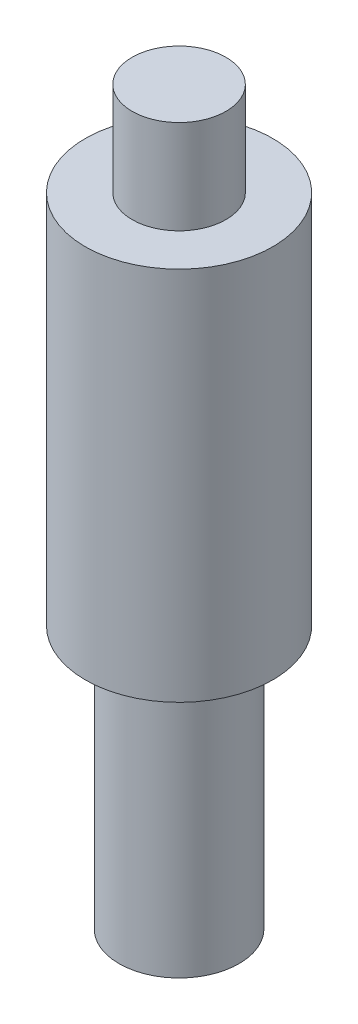
ISO-10303-21;
HEADER;
FILE_DESCRIPTION(('STEP AP214'),'2;1');
FILE_NAME('part.step','',(''),(''),'','','');
FILE_SCHEMA(('AUTOMOTIVE_DESIGN { 1 0 10303 214 1 1 1 1 }'));
ENDSEC;
DATA;
#1=APPLICATION_CONTEXT('core data for automotive mechanical design processes');
#2=APPLICATION_PROTOCOL_DEFINITION('international standard','automotive_design',2000,#1);
#3=PRODUCT_CONTEXT('',#1,'mechanical');
#4=PRODUCT('Part','Part','',(#3));
#5=PRODUCT_RELATED_PRODUCT_CATEGORY('part','',(#4));
#6=PRODUCT_DEFINITION_FORMATION('','',#4);
#7=PRODUCT_DEFINITION_CONTEXT('part definition',#1,'design');
#8=PRODUCT_DEFINITION('design','',#6,#7);
#9=PRODUCT_DEFINITION_SHAPE('','',#8);
#10=(LENGTH_UNIT() NAMED_UNIT(*) SI_UNIT(.MILLI.,.METRE.));
#11=(NAMED_UNIT(*) PLANE_ANGLE_UNIT() SI_UNIT($,.RADIAN.));
#12=(NAMED_UNIT(*) SI_UNIT($,.STERADIAN.) SOLID_ANGLE_UNIT());
#13=UNCERTAINTY_MEASURE_WITH_UNIT(LENGTH_MEASURE(1.E-05),#10,'distance_accuracy_value','');
#14=(GEOMETRIC_REPRESENTATION_CONTEXT(3) GLOBAL_UNCERTAINTY_ASSIGNED_CONTEXT((#13)) GLOBAL_UNIT_ASSIGNED_CONTEXT((#10,
#11,#12)) REPRESENTATION_CONTEXT('',''));
#15=CARTESIAN_POINT('',(0.,0.,0.));
#16=DIRECTION('',(0.,0.,1.));
#17=DIRECTION('',(1.,0.,0.));
#18=AXIS2_PLACEMENT_3D('',#15,#16,#17);
#19=CARTESIAN_POINT('',(0.,7.,0.));
#20=DIRECTION('',(0.,-1.,0.));
#21=DIRECTION('',(0.,0.,-1.));
#22=AXIS2_PLACEMENT_3D('',#19,#20,#21);
#23=CYLINDRICAL_SURFACE('',#22,1.6);
#24=CARTESIAN_POINT('',(0.,7.,0.));
#25=DIRECTION('',(0.,1.,0.));
#26=DIRECTION('',(0.,0.,1.));
#27=AXIS2_PLACEMENT_3D('',#24,#25,#26);
#28=CIRCLE('',#27,1.6);
#29=CARTESIAN_POINT('',(0.,7.,1.6));
#30=VERTEX_POINT('',#29);
#31=EDGE_CURVE('E51',#30,#30,#28,.T.);
#32=ORIENTED_EDGE('',*,*,#31,.F.);
#33=EDGE_LOOP('',(#32));
#34=FACE_BOUND('',#33,.T.);
#35=CARTESIAN_POINT('',(0.,0.,0.));
#36=DIRECTION('',(0.,1.,0.));
#37=DIRECTION('',(0.,0.,1.));
#38=AXIS2_PLACEMENT_3D('',#35,#36,#37);
#39=CIRCLE('',#38,1.6);
#40=CARTESIAN_POINT('',(0.,0.,1.6));
#41=VERTEX_POINT('',#40);
#42=EDGE_CURVE('E46',#41,#41,#39,.T.);
#43=ORIENTED_EDGE('',*,*,#42,.T.);
#44=EDGE_LOOP('',(#43));
#45=FACE_BOUND('',#44,.T.);
#46=ADVANCED_FACE('F43',(#34,#45),#23,.T.);
#47=CARTESIAN_POINT('',(0.,0.,0.));
#48=DIRECTION('',(0.,1.,0.));
#49=DIRECTION('',(0.,0.,1.));
#50=AXIS2_PLACEMENT_3D('',#47,#48,#49);
#51=PLANE('',#50);
#52=ORIENTED_EDGE('',*,*,#42,.F.);
#53=EDGE_LOOP('',(#52));
#54=FACE_BOUND('',#53,.T.);
#55=ADVANCED_FACE('F90',(#54),#51,.F.);
#56=CARTESIAN_POINT('',(0.,17.,0.));
#57=DIRECTION('',(0.,-1.,0.));
#58=DIRECTION('',(0.,0.,-1.));
#59=AXIS2_PLACEMENT_3D('',#56,#57,#58);
#60=CYLINDRICAL_SURFACE('',#59,2.5);
#61=CARTESIAN_POINT('',(0.,17.,0.));
#62=DIRECTION('',(0.,1.,0.));
#63=DIRECTION('',(0.,0.,1.));
#64=AXIS2_PLACEMENT_3D('',#61,#62,#63);
#65=CIRCLE('',#64,2.5);
#66=CARTESIAN_POINT('',(0.,17.,2.5));
#67=VERTEX_POINT('',#66);
#68=EDGE_CURVE('E60',#67,#67,#65,.T.);
#69=ORIENTED_EDGE('',*,*,#68,.F.);
#70=EDGE_LOOP('',(#69));
#71=FACE_BOUND('',#70,.T.);
#72=CARTESIAN_POINT('',(0.,7.,0.));
#73=DIRECTION('',(0.,1.,0.));
#74=DIRECTION('',(0.,0.,1.));
#75=AXIS2_PLACEMENT_3D('',#72,#73,#74);
#76=CIRCLE('',#75,2.5);
#77=CARTESIAN_POINT('',(0.,7.,2.5));
#78=VERTEX_POINT('',#77);
#79=EDGE_CURVE('E64',#78,#78,#76,.T.);
#80=ORIENTED_EDGE('',*,*,#79,.T.);
#81=EDGE_LOOP('',(#80));
#82=FACE_BOUND('',#81,.T.);
#83=ADVANCED_FACE('F95',(#71,#82),#60,.T.);
#84=CARTESIAN_POINT('',(0.,17.,0.));
#85=DIRECTION('',(0.,1.,0.));
#86=DIRECTION('',(0.,0.,1.));
#87=AXIS2_PLACEMENT_3D('',#84,#85,#86);
#88=PLANE('',#87);
#89=CARTESIAN_POINT('',(0.,17.,0.));
#90=DIRECTION('',(0.,1.,0.));
#91=DIRECTION('',(0.,0.,1.));
#92=AXIS2_PLACEMENT_3D('',#89,#90,#91);
#93=CIRCLE('',#92,1.25);
#94=CARTESIAN_POINT('',(0.,17.,1.25));
#95=VERTEX_POINT('',#94);
#96=EDGE_CURVE('E10',#95,#95,#93,.T.);
#97=ORIENTED_EDGE('',*,*,#96,.F.);
#98=EDGE_LOOP('',(#97));
#99=FACE_BOUND('',#98,.T.);
#100=ORIENTED_EDGE('',*,*,#68,.T.);
#101=EDGE_LOOP('',(#100));
#102=FACE_BOUND('',#101,.T.);
#103=ADVANCED_FACE('F85',(#99,#102),#88,.T.);
#104=CARTESIAN_POINT('',(0.,7.,0.));
#105=DIRECTION('',(0.,1.,0.));
#106=DIRECTION('',(0.,0.,1.));
#107=AXIS2_PLACEMENT_3D('',#104,#105,#106);
#108=PLANE('',#107);
#109=ORIENTED_EDGE('',*,*,#31,.T.);
#110=EDGE_LOOP('',(#109));
#111=FACE_BOUND('',#110,.T.);
#112=ORIENTED_EDGE('',*,*,#79,.F.);
#113=EDGE_LOOP('',(#112));
#114=FACE_BOUND('',#113,.T.);
#115=ADVANCED_FACE('F77',(#111,#114),#108,.F.);
#116=CARTESIAN_POINT('',(0.,19.5,0.));
#117=DIRECTION('',(0.,-1.,0.));
#118=DIRECTION('',(0.,0.,-1.));
#119=AXIS2_PLACEMENT_3D('',#116,#117,#118);
#120=CYLINDRICAL_SURFACE('',#119,1.25);
#121=CARTESIAN_POINT('',(0.,19.5,0.));
#122=DIRECTION('',(0.,1.,0.));
#123=DIRECTION('',(0.,0.,1.));
#124=AXIS2_PLACEMENT_3D('',#121,#122,#123);
#125=CIRCLE('',#124,1.25);
#126=CARTESIAN_POINT('',(0.,19.5,1.25));
#127=VERTEX_POINT('',#126);
#128=EDGE_CURVE('E59',#127,#127,#125,.T.);
#129=ORIENTED_EDGE('',*,*,#128,.F.);
#130=EDGE_LOOP('',(#129));
#131=FACE_BOUND('',#130,.T.);
#132=ORIENTED_EDGE('',*,*,#96,.T.);
#133=EDGE_LOOP('',(#132));
#134=FACE_BOUND('',#133,.T.);
#135=ADVANCED_FACE('F75',(#131,#134),#120,.T.);
#136=CARTESIAN_POINT('',(0.,19.5,0.));
#137=DIRECTION('',(0.,1.,0.));
#138=DIRECTION('',(0.,0.,1.));
#139=AXIS2_PLACEMENT_3D('',#136,#137,#138);
#140=PLANE('',#139);
#141=ORIENTED_EDGE('',*,*,#128,.T.);
#142=EDGE_LOOP('',(#141));
#143=FACE_BOUND('',#142,.T.);
#144=ADVANCED_FACE('F73',(#143),#140,.T.);
#145=CLOSED_SHELL('',(#46,#55,#83,#103,#115,#135,#144));
#146=MANIFOLD_SOLID_BREP('B2',#145);
#147=ADVANCED_BREP_SHAPE_REPRESENTATION('',(#18,#146),#14);
#148=SHAPE_DEFINITION_REPRESENTATION(#9,#147);
ENDSEC;
END-ISO-10303-21;
